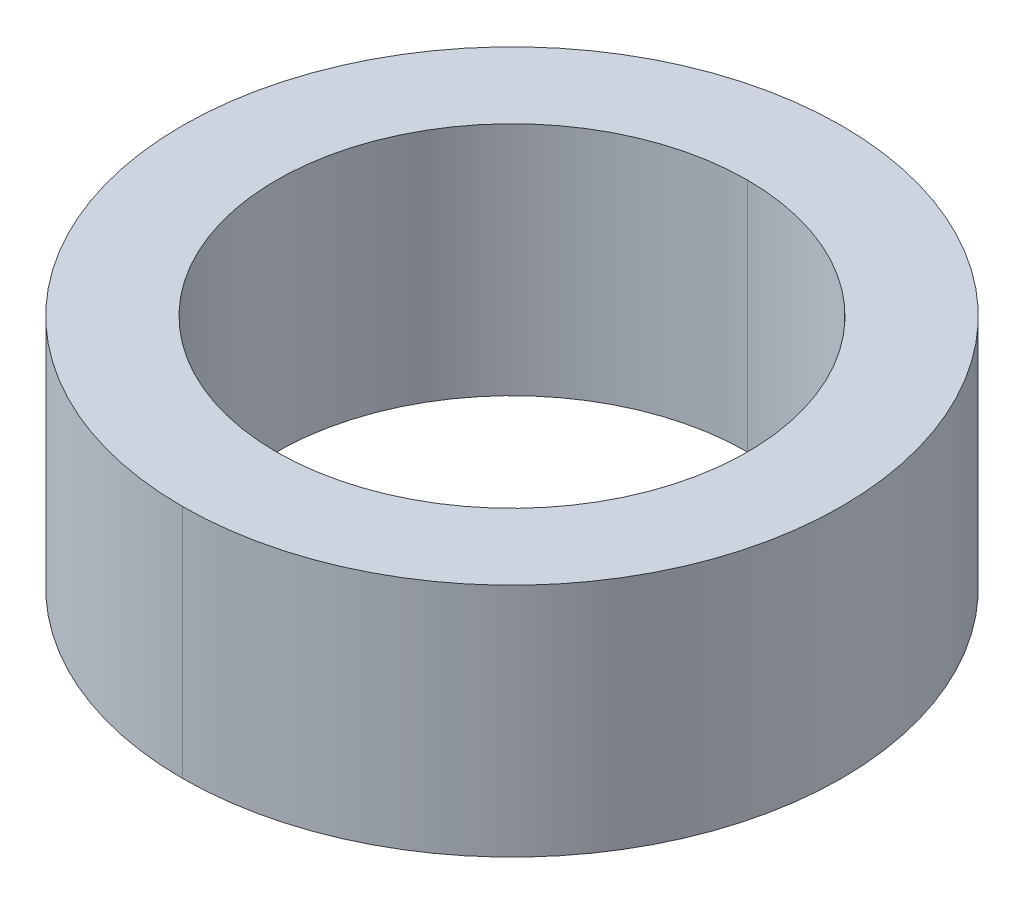
ISO-10303-21;
HEADER;
FILE_DESCRIPTION(('STEP AP214'),'2;1');
FILE_NAME('part.step','',(''),(''),'','','');
FILE_SCHEMA(('AUTOMOTIVE_DESIGN { 1 0 10303 214 1 1 1 1 }'));
ENDSEC;
DATA;
#1=APPLICATION_CONTEXT('core data for automotive mechanical design processes');
#2=APPLICATION_PROTOCOL_DEFINITION('international standard','automotive_design',2000,#1);
#3=PRODUCT_CONTEXT('',#1,'mechanical');
#4=PRODUCT('Part','Part','',(#3));
#5=PRODUCT_RELATED_PRODUCT_CATEGORY('part','',(#4));
#6=PRODUCT_DEFINITION_FORMATION('','',#4);
#7=PRODUCT_DEFINITION_CONTEXT('part definition',#1,'design');
#8=PRODUCT_DEFINITION('design','',#6,#7);
#9=PRODUCT_DEFINITION_SHAPE('','',#8);
#10=(LENGTH_UNIT() NAMED_UNIT(*) SI_UNIT(.MILLI.,.METRE.));
#11=(NAMED_UNIT(*) PLANE_ANGLE_UNIT() SI_UNIT($,.RADIAN.));
#12=(NAMED_UNIT(*) SI_UNIT($,.STERADIAN.) SOLID_ANGLE_UNIT());
#13=UNCERTAINTY_MEASURE_WITH_UNIT(LENGTH_MEASURE(1.E-05),#10,'distance_accuracy_value','');
#14=(GEOMETRIC_REPRESENTATION_CONTEXT(3) GLOBAL_UNCERTAINTY_ASSIGNED_CONTEXT((#13)) GLOBAL_UNIT_ASSIGNED_CONTEXT((#10,
#11,#12)) REPRESENTATION_CONTEXT('',''));
#15=CARTESIAN_POINT('',(0.,0.,0.));
#16=DIRECTION('',(0.,0.,1.));
#17=DIRECTION('',(1.,0.,0.));
#18=AXIS2_PLACEMENT_3D('',#15,#16,#17);
#19=CARTESIAN_POINT('',(0.,3.,0.));
#20=DIRECTION('',(0.,-1.,0.));
#21=DIRECTION('',(0.,0.,-1.));
#22=AXIS2_PLACEMENT_3D('',#19,#20,#21);
#23=CYLINDRICAL_SURFACE('',#22,3.);
#24=DIRECTION('',(0.,-1.,0.));
#25=VECTOR('',#24,1.);
#26=CARTESIAN_POINT('',(0.,3.,3.));
#27=LINE('',#26,#25);
#28=CARTESIAN_POINT('',(0.,3.,3.));
#29=VERTEX_POINT('',#28);
#30=CARTESIAN_POINT('',(0.,0.,3.));
#31=VERTEX_POINT('',#30);
#32=EDGE_CURVE('E289',#29,#31,#27,.T.);
#33=ORIENTED_EDGE('',*,*,#32,.F.);
#34=CARTESIAN_POINT('',(0.,3.,0.));
#35=DIRECTION('',(0.,1.,0.));
#36=DIRECTION('',(0.,0.,1.));
#37=AXIS2_PLACEMENT_3D('',#34,#35,#36);
#38=CIRCLE('',#37,3.);
#39=CARTESIAN_POINT('',(0.,3.,-3.));
#40=VERTEX_POINT('',#39);
#41=EDGE_CURVE('E77',#29,#40,#38,.T.);
#42=ORIENTED_EDGE('',*,*,#41,.T.);
#43=DIRECTION('',(0.,-1.,0.));
#44=VECTOR('',#43,1.);
#45=CARTESIAN_POINT('',(0.,3.,-3.));
#46=LINE('',#45,#44);
#47=CARTESIAN_POINT('',(0.,0.,-3.));
#48=VERTEX_POINT('',#47);
#49=EDGE_CURVE('E90',#40,#48,#46,.T.);
#50=ORIENTED_EDGE('',*,*,#49,.T.);
#51=CARTESIAN_POINT('',(0.,0.,0.));
#52=DIRECTION('',(0.,1.,0.));
#53=DIRECTION('',(0.,0.,1.));
#54=AXIS2_PLACEMENT_3D('',#51,#52,#53);
#55=CIRCLE('',#54,3.);
#56=EDGE_CURVE('E11',#31,#48,#55,.T.);
#57=ORIENTED_EDGE('',*,*,#56,.F.);
#58=EDGE_LOOP('',(#33,#42,#50,#57));
#59=FACE_BOUND('',#58,.T.);
#60=ADVANCED_FACE('F17',(#59),#23,.F.);
#61=CARTESIAN_POINT('',(0.,3.,0.));
#62=DIRECTION('',(0.,-1.,0.));
#63=DIRECTION('',(0.,0.,-1.));
#64=AXIS2_PLACEMENT_3D('',#61,#62,#63);
#65=CYLINDRICAL_SURFACE('',#64,4.2);
#66=DIRECTION('',(0.,-1.,0.));
#67=VECTOR('',#66,1.);
#68=CARTESIAN_POINT('',(0.,3.,4.2));
#69=LINE('',#68,#67);
#70=CARTESIAN_POINT('',(0.,3.,4.2));
#71=VERTEX_POINT('',#70);
#72=CARTESIAN_POINT('',(0.,0.,4.2));
#73=VERTEX_POINT('',#72);
#74=EDGE_CURVE('E81',#71,#73,#69,.T.);
#75=ORIENTED_EDGE('',*,*,#74,.F.);
#76=CARTESIAN_POINT('',(0.,3.,0.));
#77=DIRECTION('',(0.,1.,0.));
#78=DIRECTION('',(0.,0.,1.));
#79=AXIS2_PLACEMENT_3D('',#76,#77,#78);
#80=CIRCLE('',#79,4.2);
#81=CARTESIAN_POINT('',(0.,3.,-4.2));
#82=VERTEX_POINT('',#81);
#83=EDGE_CURVE('E71',#82,#71,#80,.T.);
#84=ORIENTED_EDGE('',*,*,#83,.F.);
#85=DIRECTION('',(0.,-1.,0.));
#86=VECTOR('',#85,1.);
#87=CARTESIAN_POINT('',(0.,3.,-4.2));
#88=LINE('',#87,#86);
#89=CARTESIAN_POINT('',(0.,0.,-4.2));
#90=VERTEX_POINT('',#89);
#91=EDGE_CURVE('E78',#82,#90,#88,.T.);
#92=ORIENTED_EDGE('',*,*,#91,.T.);
#93=CARTESIAN_POINT('',(0.,0.,0.));
#94=DIRECTION('',(0.,1.,0.));
#95=DIRECTION('',(0.,0.,1.));
#96=AXIS2_PLACEMENT_3D('',#93,#94,#95);
#97=CIRCLE('',#96,4.2);
#98=EDGE_CURVE('E20',#90,#73,#97,.T.);
#99=ORIENTED_EDGE('',*,*,#98,.T.);
#100=EDGE_LOOP('',(#75,#84,#92,#99));
#101=FACE_BOUND('',#100,.T.);
#102=ADVANCED_FACE('F82',(#101),#65,.T.);
#103=CARTESIAN_POINT('',(0.,0.,0.));
#104=DIRECTION('',(0.,1.,0.));
#105=DIRECTION('',(1.,0.,0.));
#106=AXIS2_PLACEMENT_3D('',#103,#104,#105);
#107=PLANE('',#106);
#108=CARTESIAN_POINT('',(0.,0.,0.));
#109=DIRECTION('',(0.,1.,0.));
#110=DIRECTION('',(0.,0.,1.));
#111=AXIS2_PLACEMENT_3D('',#108,#109,#110);
#112=CIRCLE('',#111,3.);
#113=EDGE_CURVE('E96',#48,#31,#112,.T.);
#114=ORIENTED_EDGE('',*,*,#113,.T.);
#115=ORIENTED_EDGE('',*,*,#56,.T.);
#116=EDGE_LOOP('',(#114,#115));
#117=FACE_BOUND('',#116,.T.);
#118=ORIENTED_EDGE('',*,*,#98,.F.);
#119=CARTESIAN_POINT('',(0.,0.,0.));
#120=DIRECTION('',(0.,1.,0.));
#121=DIRECTION('',(0.,0.,1.));
#122=AXIS2_PLACEMENT_3D('',#119,#120,#121);
#123=CIRCLE('',#122,4.2);
#124=EDGE_CURVE('E86',#73,#90,#123,.T.);
#125=ORIENTED_EDGE('',*,*,#124,.F.);
#126=EDGE_LOOP('',(#118,#125));
#127=FACE_BOUND('',#126,.T.);
#128=ADVANCED_FACE('F122',(#117,#127),#107,.F.);
#129=CARTESIAN_POINT('',(0.,3.,0.));
#130=DIRECTION('',(0.,1.,0.));
#131=DIRECTION('',(1.,0.,0.));
#132=AXIS2_PLACEMENT_3D('',#129,#130,#131);
#133=PLANE('',#132);
#134=CARTESIAN_POINT('',(0.,3.,0.));
#135=DIRECTION('',(0.,1.,0.));
#136=DIRECTION('',(0.,0.,1.));
#137=AXIS2_PLACEMENT_3D('',#134,#135,#136);
#138=CIRCLE('',#137,3.);
#139=EDGE_CURVE('E294',#40,#29,#138,.T.);
#140=ORIENTED_EDGE('',*,*,#139,.F.);
#141=ORIENTED_EDGE('',*,*,#41,.F.);
#142=EDGE_LOOP('',(#140,#141));
#143=FACE_BOUND('',#142,.T.);
#144=ORIENTED_EDGE('',*,*,#83,.T.);
#145=CARTESIAN_POINT('',(0.,3.,0.));
#146=DIRECTION('',(0.,1.,0.));
#147=DIRECTION('',(0.,0.,1.));
#148=AXIS2_PLACEMENT_3D('',#145,#146,#147);
#149=CIRCLE('',#148,4.2);
#150=EDGE_CURVE('E74',#71,#82,#149,.T.);
#151=ORIENTED_EDGE('',*,*,#150,.T.);
#152=EDGE_LOOP('',(#144,#151));
#153=FACE_BOUND('',#152,.T.);
#154=ADVANCED_FACE('F72',(#143,#153),#133,.T.);
#155=CARTESIAN_POINT('',(0.,3.,0.));
#156=DIRECTION('',(0.,-1.,0.));
#157=DIRECTION('',(0.,0.,-1.));
#158=AXIS2_PLACEMENT_3D('',#155,#156,#157);
#159=CYLINDRICAL_SURFACE('',#158,4.2);
#160=ORIENTED_EDGE('',*,*,#150,.F.);
#161=ORIENTED_EDGE('',*,*,#74,.T.);
#162=ORIENTED_EDGE('',*,*,#124,.T.);
#163=ORIENTED_EDGE('',*,*,#91,.F.);
#164=EDGE_LOOP('',(#160,#161,#162,#163));
#165=FACE_BOUND('',#164,.T.);
#166=ADVANCED_FACE('F88',(#165),#159,.T.);
#167=CARTESIAN_POINT('',(0.,3.,0.));
#168=DIRECTION('',(0.,-1.,0.));
#169=DIRECTION('',(0.,0.,-1.));
#170=AXIS2_PLACEMENT_3D('',#167,#168,#169);
#171=CYLINDRICAL_SURFACE('',#170,3.);
#172=ORIENTED_EDGE('',*,*,#139,.T.);
#173=ORIENTED_EDGE('',*,*,#32,.T.);
#174=ORIENTED_EDGE('',*,*,#113,.F.);
#175=ORIENTED_EDGE('',*,*,#49,.F.);
#176=EDGE_LOOP('',(#172,#173,#174,#175));
#177=FACE_BOUND('',#176,.T.);
#178=ADVANCED_FACE('F142',(#177),#171,.F.);
#179=CLOSED_SHELL('',(#60,#102,#128,#154,#166,#178));
#180=MANIFOLD_SOLID_BREP('B1',#179);
#181=ADVANCED_BREP_SHAPE_REPRESENTATION('',(#18,#180),#14);
#182=SHAPE_DEFINITION_REPRESENTATION(#9,#181);
ENDSEC;
END-ISO-10303-21;
